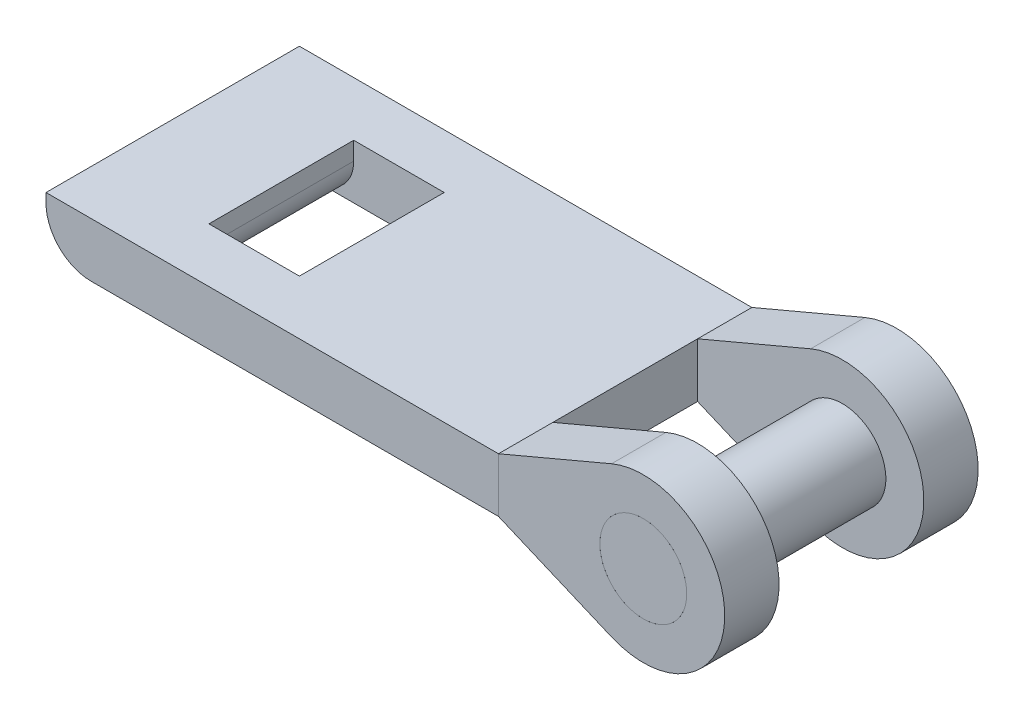
ISO-10303-21;
HEADER;
FILE_DESCRIPTION(('STEP AP214'),'2;1');
FILE_NAME('part.step','',(''),(''),'','','');
FILE_SCHEMA(('AUTOMOTIVE_DESIGN { 1 0 10303 214 1 1 1 1 }'));
ENDSEC;
DATA;
#1=APPLICATION_CONTEXT('core data for automotive mechanical design processes');
#2=APPLICATION_PROTOCOL_DEFINITION('international standard','automotive_design',2000,#1);
#3=PRODUCT_CONTEXT('',#1,'mechanical');
#4=PRODUCT('Part','Part','',(#3));
#5=PRODUCT_RELATED_PRODUCT_CATEGORY('part','',(#4));
#6=PRODUCT_DEFINITION_FORMATION('','',#4);
#7=PRODUCT_DEFINITION_CONTEXT('part definition',#1,'design');
#8=PRODUCT_DEFINITION('design','',#6,#7);
#9=PRODUCT_DEFINITION_SHAPE('','',#8);
#10=(LENGTH_UNIT() NAMED_UNIT(*) SI_UNIT(.MILLI.,.METRE.));
#11=(NAMED_UNIT(*) PLANE_ANGLE_UNIT() SI_UNIT($,.RADIAN.));
#12=(NAMED_UNIT(*) SI_UNIT($,.STERADIAN.) SOLID_ANGLE_UNIT());
#13=UNCERTAINTY_MEASURE_WITH_UNIT(LENGTH_MEASURE(1.E-05),#10,'distance_accuracy_value','');
#14=(GEOMETRIC_REPRESENTATION_CONTEXT(3) GLOBAL_UNCERTAINTY_ASSIGNED_CONTEXT((#13)) GLOBAL_UNIT_ASSIGNED_CONTEXT((#10,
#11,#12)) REPRESENTATION_CONTEXT('',''));
#15=CARTESIAN_POINT('',(0.,0.,0.));
#16=DIRECTION('',(0.,0.,1.));
#17=DIRECTION('',(1.,0.,0.));
#18=AXIS2_PLACEMENT_3D('',#15,#16,#17);
#19=CARTESIAN_POINT('',(-17.0003573718148,36.6972014984433,7.));
#20=DIRECTION('',(0.,-1.,0.));
#21=DIRECTION('',(0.,0.,-1.));
#22=AXIS2_PLACEMENT_3D('',#19,#20,#21);
#23=PLANE('',#22);
#24=DIRECTION('',(1.,0.,0.));
#25=VECTOR('',#24,1.);
#26=CARTESIAN_POINT('',(-9.00035737181482,36.6972014984433,4.));
#27=LINE('',#26,#25);
#28=CARTESIAN_POINT('',(-14.0003573718148,36.6972014984433,4.));
#29=VERTEX_POINT('',#28);
#30=CARTESIAN_POINT('',(-9.00035737181482,36.6972014984433,4.));
#31=VERTEX_POINT('',#30);
#32=EDGE_CURVE('E150',#29,#31,#27,.T.);
#33=ORIENTED_EDGE('',*,*,#32,.F.);
#34=DIRECTION('',(0.,0.,1.));
#35=VECTOR('',#34,1.);
#36=CARTESIAN_POINT('',(-14.0003573718148,36.6972014984433,4.));
#37=LINE('',#36,#35);
#38=CARTESIAN_POINT('',(-14.0003573718148,36.6972014984433,-4.));
#39=VERTEX_POINT('',#38);
#40=EDGE_CURVE('E145',#39,#29,#37,.T.);
#41=ORIENTED_EDGE('',*,*,#40,.F.);
#42=DIRECTION('',(-1.,0.,0.));
#43=VECTOR('',#42,1.);
#44=CARTESIAN_POINT('',(-9.00035737181482,36.6972014984433,-4.));
#45=LINE('',#44,#43);
#46=CARTESIAN_POINT('',(-9.00035737181482,36.6972014984433,-4.));
#47=VERTEX_POINT('',#46);
#48=EDGE_CURVE('E156',#47,#39,#45,.T.);
#49=ORIENTED_EDGE('',*,*,#48,.F.);
#50=DIRECTION('',(0.,0.,-1.));
#51=VECTOR('',#50,1.);
#52=CARTESIAN_POINT('',(-9.00035737181482,36.6972014984433,4.));
#53=LINE('',#52,#51);
#54=EDGE_CURVE('E153',#31,#47,#53,.T.);
#55=ORIENTED_EDGE('',*,*,#54,.F.);
#56=EDGE_LOOP('',(#33,#41,#49,#55));
#57=FACE_BOUND('',#56,.T.);
#58=DIRECTION('',(0.,0.,-1.));
#59=VECTOR('',#58,1.);
#60=CARTESIAN_POINT('',(4.99964262818518,36.6972014984433,7.));
#61=LINE('',#60,#59);
#62=CARTESIAN_POINT('',(4.99964262818518,36.6972014984433,7.));
#63=VERTEX_POINT('',#62);
#64=CARTESIAN_POINT('',(4.99964262818518,36.6972014984433,-7.));
#65=VERTEX_POINT('',#64);
#66=EDGE_CURVE('E162',#63,#65,#61,.T.);
#67=ORIENTED_EDGE('',*,*,#66,.T.);
#68=DIRECTION('',(1.,0.,0.));
#69=VECTOR('',#68,1.);
#70=CARTESIAN_POINT('',(-17.0003573718148,36.6972014984433,-7.));
#71=LINE('',#70,#69);
#72=CARTESIAN_POINT('',(-20.0003573718148,36.6972014984433,-7.));
#73=VERTEX_POINT('',#72);
#74=EDGE_CURVE('E142',#73,#65,#71,.T.);
#75=ORIENTED_EDGE('',*,*,#74,.F.);
#76=DIRECTION('',(0.,0.,-1.));
#77=VECTOR('',#76,1.);
#78=CARTESIAN_POINT('',(-20.0003573718148,36.6972014984433,7.));
#79=LINE('',#78,#77);
#80=CARTESIAN_POINT('',(-20.0003573718148,36.6972014984433,7.));
#81=VERTEX_POINT('',#80);
#82=EDGE_CURVE('E126',#81,#73,#79,.T.);
#83=ORIENTED_EDGE('',*,*,#82,.F.);
#84=DIRECTION('',(1.,0.,0.));
#85=VECTOR('',#84,1.);
#86=CARTESIAN_POINT('',(-17.0003573718148,36.6972014984433,7.));
#87=LINE('',#86,#85);
#88=EDGE_CURVE('E132',#81,#63,#87,.T.);
#89=ORIENTED_EDGE('',*,*,#88,.T.);
#90=EDGE_LOOP('',(#67,#75,#83,#89));
#91=FACE_BOUND('',#90,.T.);
#92=ADVANCED_FACE('F46',(#57,#91),#23,.F.);
#93=CARTESIAN_POINT('',(-17.0003573718148,36.6972014984433,-7.));
#94=DIRECTION('',(0.,0.,1.));
#95=DIRECTION('',(1.,0.,0.));
#96=AXIS2_PLACEMENT_3D('',#93,#94,#95);
#97=PLANE('',#96);
#98=DIRECTION('',(1.,0.,0.));
#99=VECTOR('',#98,1.);
#100=CARTESIAN_POINT('',(-17.0003573718148,33.6972014984433,-7.));
#101=LINE('',#100,#99);
#102=CARTESIAN_POINT('',(-17.5003573718148,33.6972014984433,-7.));
#103=VERTEX_POINT('',#102);
#104=CARTESIAN_POINT('',(4.99964262818518,33.6972014984433,-7.));
#105=VERTEX_POINT('',#104);
#106=EDGE_CURVE('E177',#103,#105,#101,.T.);
#107=ORIENTED_EDGE('',*,*,#106,.F.);
#108=CARTESIAN_POINT('',(-17.5003573718148,36.1972014984433,-7.));
#109=DIRECTION('',(0.,0.,1.));
#110=DIRECTION('',(1.,0.,0.));
#111=AXIS2_PLACEMENT_3D('',#108,#109,#110);
#112=CIRCLE('',#111,2.5);
#113=CARTESIAN_POINT('',(-20.0003573718148,36.1972014984433,-7.));
#114=VERTEX_POINT('',#113);
#115=EDGE_CURVE('E12',#103,#114,#112,.F.);
#116=ORIENTED_EDGE('',*,*,#115,.T.);
#117=DIRECTION('',(0.,-1.,0.));
#118=VECTOR('',#117,1.);
#119=CARTESIAN_POINT('',(-20.0003573718148,36.6972014984433,-7.));
#120=LINE('',#119,#118);
#121=EDGE_CURVE('E143',#73,#114,#120,.T.);
#122=ORIENTED_EDGE('',*,*,#121,.F.);
#123=ORIENTED_EDGE('',*,*,#74,.T.);
#124=DIRECTION('',(0.,-1.,0.));
#125=VECTOR('',#124,1.);
#126=CARTESIAN_POINT('',(4.99964262818518,36.6972014984433,-7.));
#127=LINE('',#126,#125);
#128=EDGE_CURVE('E169',#65,#105,#127,.T.);
#129=ORIENTED_EDGE('',*,*,#128,.T.);
#130=EDGE_LOOP('',(#107,#116,#122,#123,#129));
#131=FACE_BOUND('',#130,.T.);
#132=ADVANCED_FACE('F233',(#131),#97,.F.);
#133=CARTESIAN_POINT('',(-17.0003573718148,33.6972014984433,-7.));
#134=DIRECTION('',(0.,1.,0.));
#135=DIRECTION('',(0.,0.,1.));
#136=AXIS2_PLACEMENT_3D('',#133,#134,#135);
#137=PLANE('',#136);
#138=DIRECTION('',(0.,0.,1.));
#139=VECTOR('',#138,1.);
#140=CARTESIAN_POINT('',(-16.0003573718148,33.6972014984433,-7.));
#141=LINE('',#140,#139);
#142=CARTESIAN_POINT('',(-16.0003573718148,33.6972014984433,-4.));
#143=VERTEX_POINT('',#142);
#144=CARTESIAN_POINT('',(-16.0003573718148,33.6972014984433,4.));
#145=VERTEX_POINT('',#144);
#146=EDGE_CURVE('E188',#143,#145,#141,.T.);
#147=ORIENTED_EDGE('',*,*,#146,.T.);
#148=DIRECTION('',(1.,0.,0.));
#149=VECTOR('',#148,1.);
#150=CARTESIAN_POINT('',(-17.0003573718148,33.6972014984433,4.));
#151=LINE('',#150,#149);
#152=CARTESIAN_POINT('',(-9.00035737181482,33.6972014984433,4.));
#153=VERTEX_POINT('',#152);
#154=EDGE_CURVE('E180',#145,#153,#151,.T.);
#155=ORIENTED_EDGE('',*,*,#154,.T.);
#156=DIRECTION('',(0.,0.,-1.));
#157=VECTOR('',#156,1.);
#158=CARTESIAN_POINT('',(-9.00035737181482,33.6972014984433,-7.));
#159=LINE('',#158,#157);
#160=CARTESIAN_POINT('',(-9.00035737181482,33.6972014984433,-4.));
#161=VERTEX_POINT('',#160);
#162=EDGE_CURVE('E183',#153,#161,#159,.T.);
#163=ORIENTED_EDGE('',*,*,#162,.T.);
#164=DIRECTION('',(-1.,0.,0.));
#165=VECTOR('',#164,1.);
#166=CARTESIAN_POINT('',(-17.0003573718148,33.6972014984433,-4.));
#167=LINE('',#166,#165);
#168=EDGE_CURVE('E186',#161,#143,#167,.T.);
#169=ORIENTED_EDGE('',*,*,#168,.T.);
#170=EDGE_LOOP('',(#147,#155,#163,#169));
#171=FACE_BOUND('',#170,.T.);
#172=DIRECTION('',(1.,0.,0.));
#173=VECTOR('',#172,1.);
#174=CARTESIAN_POINT('',(-17.0003573718148,33.6972014984433,7.));
#175=LINE('',#174,#173);
#176=CARTESIAN_POINT('',(-17.5003573718148,33.6972014984433,7.));
#177=VERTEX_POINT('',#176);
#178=CARTESIAN_POINT('',(4.99964262818518,33.6972014984433,7.));
#179=VERTEX_POINT('',#178);
#180=EDGE_CURVE('E139',#177,#179,#175,.T.);
#181=ORIENTED_EDGE('',*,*,#180,.F.);
#182=DIRECTION('',(0.,0.,1.));
#183=VECTOR('',#182,1.);
#184=CARTESIAN_POINT('',(-17.5003573718148,33.6972014984433,-7.));
#185=LINE('',#184,#183);
#186=EDGE_CURVE('E54',#177,#103,#185,.F.);
#187=ORIENTED_EDGE('',*,*,#186,.T.);
#188=ORIENTED_EDGE('',*,*,#106,.T.);
#189=DIRECTION('',(0.,0.,1.));
#190=VECTOR('',#189,1.);
#191=CARTESIAN_POINT('',(4.99964262818518,33.6972014984433,-7.));
#192=LINE('',#191,#190);
#193=EDGE_CURVE('E172',#105,#179,#192,.T.);
#194=ORIENTED_EDGE('',*,*,#193,.T.);
#195=EDGE_LOOP('',(#181,#187,#188,#194));
#196=FACE_BOUND('',#195,.T.);
#197=ADVANCED_FACE('F210',(#171,#196),#137,.F.);
#198=CARTESIAN_POINT('',(-17.0003573718148,33.6972014984433,7.));
#199=DIRECTION('',(0.,0.,-1.));
#200=DIRECTION('',(-1.,0.,0.));
#201=AXIS2_PLACEMENT_3D('',#198,#199,#200);
#202=PLANE('',#201);
#203=DIRECTION('',(0.,1.,0.));
#204=VECTOR('',#203,1.);
#205=CARTESIAN_POINT('',(-20.0003573718148,33.6972014984433,7.));
#206=LINE('',#205,#204);
#207=CARTESIAN_POINT('',(-20.0003573718148,36.1972014984433,7.));
#208=VERTEX_POINT('',#207);
#209=EDGE_CURVE('E121',#208,#81,#206,.T.);
#210=ORIENTED_EDGE('',*,*,#209,.F.);
#211=CARTESIAN_POINT('',(-17.5003573718148,36.1972014984433,7.));
#212=DIRECTION('',(0.,0.,-1.));
#213=DIRECTION('',(-1.,0.,0.));
#214=AXIS2_PLACEMENT_3D('',#211,#212,#213);
#215=CIRCLE('',#214,2.5);
#216=EDGE_CURVE('E68',#208,#177,#215,.F.);
#217=ORIENTED_EDGE('',*,*,#216,.T.);
#218=ORIENTED_EDGE('',*,*,#180,.T.);
#219=DIRECTION('',(0.,1.,0.));
#220=VECTOR('',#219,1.);
#221=CARTESIAN_POINT('',(4.99964262818518,33.6972014984433,7.));
#222=LINE('',#221,#220);
#223=EDGE_CURVE('E135',#179,#63,#222,.T.);
#224=ORIENTED_EDGE('',*,*,#223,.T.);
#225=ORIENTED_EDGE('',*,*,#88,.F.);
#226=EDGE_LOOP('',(#210,#217,#218,#224,#225));
#227=FACE_BOUND('',#226,.T.);
#228=ADVANCED_FACE('F133',(#227),#202,.F.);
#229=CARTESIAN_POINT('',(4.99964262818518,0.,0.));
#230=DIRECTION('',(-1.,0.,0.));
#231=DIRECTION('',(0.,0.,1.));
#232=AXIS2_PLACEMENT_3D('',#229,#230,#231);
#233=PLANE('',#232);
#234=ORIENTED_EDGE('',*,*,#66,.F.);
#235=ORIENTED_EDGE('',*,*,#223,.F.);
#236=ORIENTED_EDGE('',*,*,#193,.F.);
#237=ORIENTED_EDGE('',*,*,#128,.F.);
#238=EDGE_LOOP('',(#234,#235,#236,#237));
#239=FACE_BOUND('',#238,.T.);
#240=ADVANCED_FACE('F245',(#239),#233,.F.);
#241=CARTESIAN_POINT('',(-14.0003573718148,30.6972014984433,4.));
#242=DIRECTION('',(-1.,0.,0.));
#243=DIRECTION('',(0.,0.,1.));
#244=AXIS2_PLACEMENT_3D('',#241,#242,#243);
#245=PLANE('',#244);
#246=DIRECTION('',(0.,1.,0.));
#247=VECTOR('',#246,1.);
#248=CARTESIAN_POINT('',(-14.0003573718148,30.6972014984433,4.));
#249=LINE('',#248,#247);
#250=CARTESIAN_POINT('',(-14.0003573718148,35.6972014984433,4.));
#251=VERTEX_POINT('',#250);
#252=EDGE_CURVE('E159',#251,#29,#249,.T.);
#253=ORIENTED_EDGE('',*,*,#252,.F.);
#254=DIRECTION('',(0.,0.,1.));
#255=VECTOR('',#254,1.);
#256=CARTESIAN_POINT('',(-14.0003573718148,35.6972014984433,4.));
#257=LINE('',#256,#255);
#258=CARTESIAN_POINT('',(-14.0003573718148,35.6972014984433,-4.));
#259=VERTEX_POINT('',#258);
#260=EDGE_CURVE('E191',#251,#259,#257,.F.);
#261=ORIENTED_EDGE('',*,*,#260,.T.);
#262=DIRECTION('',(0.,1.,0.));
#263=VECTOR('',#262,1.);
#264=CARTESIAN_POINT('',(-14.0003573718148,30.6972014984433,-4.));
#265=LINE('',#264,#263);
#266=EDGE_CURVE('E160',#259,#39,#265,.T.);
#267=ORIENTED_EDGE('',*,*,#266,.T.);
#268=ORIENTED_EDGE('',*,*,#40,.T.);
#269=EDGE_LOOP('',(#253,#261,#267,#268));
#270=FACE_BOUND('',#269,.T.);
#271=ADVANCED_FACE('F221',(#270),#245,.F.);
#272=CARTESIAN_POINT('',(-9.00035737181482,30.6972014984433,-4.));
#273=DIRECTION('',(0.,0.,-1.));
#274=DIRECTION('',(-1.,0.,0.));
#275=AXIS2_PLACEMENT_3D('',#272,#273,#274);
#276=PLANE('',#275);
#277=DIRECTION('',(0.,1.,0.));
#278=VECTOR('',#277,1.);
#279=CARTESIAN_POINT('',(-9.00035737181482,30.6972014984433,-4.));
#280=LINE('',#279,#278);
#281=EDGE_CURVE('E163',#161,#47,#280,.T.);
#282=ORIENTED_EDGE('',*,*,#281,.T.);
#283=ORIENTED_EDGE('',*,*,#48,.T.);
#284=ORIENTED_EDGE('',*,*,#266,.F.);
#285=CARTESIAN_POINT('',(-16.0003573718148,35.6972014984433,-4.));
#286=DIRECTION('',(0.,0.,-1.));
#287=DIRECTION('',(-1.,0.,0.));
#288=AXIS2_PLACEMENT_3D('',#285,#286,#287);
#289=CIRCLE('',#288,2.);
#290=EDGE_CURVE('E195',#259,#143,#289,.T.);
#291=ORIENTED_EDGE('',*,*,#290,.T.);
#292=ORIENTED_EDGE('',*,*,#168,.F.);
#293=EDGE_LOOP('',(#282,#283,#284,#291,#292));
#294=FACE_BOUND('',#293,.T.);
#295=ADVANCED_FACE('F203',(#294),#276,.F.);
#296=CARTESIAN_POINT('',(-9.00035737181482,30.6972014984433,4.));
#297=DIRECTION('',(1.,0.,0.));
#298=DIRECTION('',(0.,0.,-1.));
#299=AXIS2_PLACEMENT_3D('',#296,#297,#298);
#300=PLANE('',#299);
#301=DIRECTION('',(0.,1.,0.));
#302=VECTOR('',#301,1.);
#303=CARTESIAN_POINT('',(-9.00035737181482,30.6972014984433,4.));
#304=LINE('',#303,#302);
#305=EDGE_CURVE('E165',#153,#31,#304,.T.);
#306=ORIENTED_EDGE('',*,*,#305,.T.);
#307=ORIENTED_EDGE('',*,*,#54,.T.);
#308=ORIENTED_EDGE('',*,*,#281,.F.);
#309=ORIENTED_EDGE('',*,*,#162,.F.);
#310=EDGE_LOOP('',(#306,#307,#308,#309));
#311=FACE_BOUND('',#310,.T.);
#312=ADVANCED_FACE('F213',(#311),#300,.F.);
#313=CARTESIAN_POINT('',(-9.00035737181482,30.6972014984433,4.));
#314=DIRECTION('',(0.,0.,1.));
#315=DIRECTION('',(1.,0.,0.));
#316=AXIS2_PLACEMENT_3D('',#313,#314,#315);
#317=PLANE('',#316);
#318=ORIENTED_EDGE('',*,*,#154,.F.);
#319=CARTESIAN_POINT('',(-16.0003573718148,35.6972014984433,4.));
#320=DIRECTION('',(0.,0.,1.));
#321=DIRECTION('',(1.,0.,0.));
#322=AXIS2_PLACEMENT_3D('',#319,#320,#321);
#323=CIRCLE('',#322,2.);
#324=EDGE_CURVE('E193',#145,#251,#323,.T.);
#325=ORIENTED_EDGE('',*,*,#324,.T.);
#326=ORIENTED_EDGE('',*,*,#252,.T.);
#327=ORIENTED_EDGE('',*,*,#32,.T.);
#328=ORIENTED_EDGE('',*,*,#305,.F.);
#329=EDGE_LOOP('',(#318,#325,#326,#327,#328));
#330=FACE_BOUND('',#329,.T.);
#331=ADVANCED_FACE('F223',(#330),#317,.F.);
#332=CARTESIAN_POINT('',(-16.0003573718148,35.6972014984433,-7.));
#333=DIRECTION('',(0.,0.,1.));
#334=DIRECTION('',(1.,0.,0.));
#335=AXIS2_PLACEMENT_3D('',#332,#333,#334);
#336=CYLINDRICAL_SURFACE('',#335,2.);
#337=ORIENTED_EDGE('',*,*,#290,.F.);
#338=ORIENTED_EDGE('',*,*,#260,.F.);
#339=ORIENTED_EDGE('',*,*,#324,.F.);
#340=ORIENTED_EDGE('',*,*,#146,.F.);
#341=EDGE_LOOP('',(#337,#338,#339,#340));
#342=FACE_BOUND('',#341,.T.);
#343=ADVANCED_FACE('F208',(#342),#336,.T.);
#344=CARTESIAN_POINT('',(-20.0003573718148,0.,0.));
#345=DIRECTION('',(-1.,0.,0.));
#346=DIRECTION('',(0.,0.,1.));
#347=AXIS2_PLACEMENT_3D('',#344,#345,#346);
#348=PLANE('',#347);
#349=ORIENTED_EDGE('',*,*,#121,.T.);
#350=DIRECTION('',(0.,0.,1.));
#351=VECTOR('',#350,1.);
#352=CARTESIAN_POINT('',(-20.0003573718148,36.1972014984433,7.));
#353=LINE('',#352,#351);
#354=EDGE_CURVE('E129',#114,#208,#353,.T.);
#355=ORIENTED_EDGE('',*,*,#354,.T.);
#356=ORIENTED_EDGE('',*,*,#209,.T.);
#357=ORIENTED_EDGE('',*,*,#82,.T.);
#358=EDGE_LOOP('',(#349,#355,#356,#357));
#359=FACE_BOUND('',#358,.T.);
#360=ADVANCED_FACE('F124',(#359),#348,.T.);
#361=CARTESIAN_POINT('',(-17.5003573718148,36.1972014984433,0.));
#362=DIRECTION('',(0.,0.,-1.));
#363=DIRECTION('',(-1.,0.,0.));
#364=AXIS2_PLACEMENT_3D('',#361,#362,#363);
#365=CYLINDRICAL_SURFACE('',#364,2.5);
#366=ORIENTED_EDGE('',*,*,#115,.F.);
#367=ORIENTED_EDGE('',*,*,#186,.F.);
#368=ORIENTED_EDGE('',*,*,#216,.F.);
#369=ORIENTED_EDGE('',*,*,#354,.F.);
#370=EDGE_LOOP('',(#366,#367,#368,#369));
#371=FACE_BOUND('',#370,.T.);
#372=ADVANCED_FACE('F48',(#371),#365,.T.);
#373=CLOSED_SHELL('',(#92,#132,#197,#228,#240,#271,#295,#312,#331,#343,#360,#372));
#374=MANIFOLD_SOLID_BREP('B2',#373);
#375=CARTESIAN_POINT('',(12.9996426281852,35.1972014984433,4.));
#376=DIRECTION('',(0.,0.,1.));
#377=DIRECTION('',(-1.,0.,0.));
#378=AXIS2_PLACEMENT_3D('',#375,#376,#377);
#379=CYLINDRICAL_SURFACE('',#378,4.5);
#380=CARTESIAN_POINT('',(12.9996426281852,35.1972014984433,7.));
#381=DIRECTION('',(0.,0.,-1.));
#382=DIRECTION('',(-1.,0.,0.));
#383=AXIS2_PLACEMENT_3D('',#380,#381,#382);
#384=CIRCLE('',#383,4.5);
#385=CARTESIAN_POINT('',(11.2453894566545,39.3411845836133,7.));
#386=VERTEX_POINT('',#385);
#387=CARTESIAN_POINT('',(11.2453894566545,31.0532184132734,7.));
#388=VERTEX_POINT('',#387);
#389=EDGE_CURVE('E414',#386,#388,#384,.T.);
#390=ORIENTED_EDGE('',*,*,#389,.T.);
#391=DIRECTION('',(0.,0.,1.));
#392=VECTOR('',#391,1.);
#393=CARTESIAN_POINT('',(11.2453894566545,31.0532184132734,4.));
#394=LINE('',#393,#392);
#395=CARTESIAN_POINT('',(11.2453894566545,31.0532184132734,4.));
#396=VERTEX_POINT('',#395);
#397=EDGE_CURVE('E353',#396,#388,#394,.T.);
#398=ORIENTED_EDGE('',*,*,#397,.F.);
#399=CARTESIAN_POINT('',(12.9996426281852,35.1972014984433,4.));
#400=DIRECTION('',(0.,0.,-1.));
#401=DIRECTION('',(-1.,0.,0.));
#402=AXIS2_PLACEMENT_3D('',#399,#400,#401);
#403=CIRCLE('',#402,4.5);
#404=CARTESIAN_POINT('',(11.2453894566545,39.3411845836133,4.));
#405=VERTEX_POINT('',#404);
#406=EDGE_CURVE('E403',#405,#396,#403,.T.);
#407=ORIENTED_EDGE('',*,*,#406,.F.);
#408=DIRECTION('',(0.,0.,1.));
#409=VECTOR('',#408,1.);
#410=CARTESIAN_POINT('',(11.2453894566545,39.3411845836133,4.));
#411=LINE('',#410,#409);
#412=EDGE_CURVE('E44',#405,#386,#411,.T.);
#413=ORIENTED_EDGE('',*,*,#412,.T.);
#414=EDGE_LOOP('',(#390,#398,#407,#413));
#415=FACE_BOUND('',#414,.T.);
#416=ADVANCED_FACE('F350',(#415),#379,.T.);
#417=CARTESIAN_POINT('',(11.2453894566545,39.3411845836133,4.));
#418=DIRECTION('',(-0.389834038117918,0.920885130037768,0.));
#419=DIRECTION('',(-0.920885130037768,-0.389834038117919,0.));
#420=AXIS2_PLACEMENT_3D('',#417,#418,#419);
#421=PLANE('',#420);
#422=DIRECTION('',(0.920885130037768,0.389834038117918,0.));
#423=VECTOR('',#422,1.);
#424=CARTESIAN_POINT('',(11.2453894566545,39.3411845836133,7.));
#425=LINE('',#424,#423);
#426=CARTESIAN_POINT('',(4.99964262818518,36.6972014984433,7.));
#427=VERTEX_POINT('',#426);
#428=EDGE_CURVE('E391',#427,#386,#425,.T.);
#429=ORIENTED_EDGE('',*,*,#428,.T.);
#430=ORIENTED_EDGE('',*,*,#412,.F.);
#431=DIRECTION('',(0.920885130037768,0.389834038117918,0.));
#432=VECTOR('',#431,1.);
#433=CARTESIAN_POINT('',(11.2453894566545,39.3411845836133,4.));
#434=LINE('',#433,#432);
#435=CARTESIAN_POINT('',(4.99964262818518,36.6972014984433,4.));
#436=VERTEX_POINT('',#435);
#437=EDGE_CURVE('E368',#436,#405,#434,.T.);
#438=ORIENTED_EDGE('',*,*,#437,.F.);
#439=DIRECTION('',(0.,0.,1.));
#440=VECTOR('',#439,1.);
#441=CARTESIAN_POINT('',(4.99964262818518,36.6972014984433,4.));
#442=LINE('',#441,#440);
#443=EDGE_CURVE('E359',#436,#427,#442,.T.);
#444=ORIENTED_EDGE('',*,*,#443,.T.);
#445=EDGE_LOOP('',(#429,#430,#438,#444));
#446=FACE_BOUND('',#445,.T.);
#447=ADVANCED_FACE('F421',(#446),#421,.T.);
#448=CARTESIAN_POINT('',(4.99964262818518,33.6972014984433,4.));
#449=DIRECTION('',(-1.,0.,0.));
#450=DIRECTION('',(0.,0.,-1.));
#451=AXIS2_PLACEMENT_3D('',#448,#449,#450);
#452=PLANE('',#451);
#453=DIRECTION('',(0.,1.,0.));
#454=VECTOR('',#453,1.);
#455=CARTESIAN_POINT('',(4.99964262818518,33.6972014984433,7.));
#456=LINE('',#455,#454);
#457=CARTESIAN_POINT('',(4.99964262818518,33.6972014984433,7.));
#458=VERTEX_POINT('',#457);
#459=EDGE_CURVE('E385',#458,#427,#456,.T.);
#460=ORIENTED_EDGE('',*,*,#459,.T.);
#461=ORIENTED_EDGE('',*,*,#443,.F.);
#462=DIRECTION('',(0.,1.,0.));
#463=VECTOR('',#462,1.);
#464=CARTESIAN_POINT('',(4.99964262818518,33.6972014984433,4.));
#465=LINE('',#464,#463);
#466=CARTESIAN_POINT('',(4.99964262818518,33.6972014984433,4.));
#467=VERTEX_POINT('',#466);
#468=EDGE_CURVE('E401',#467,#436,#465,.T.);
#469=ORIENTED_EDGE('',*,*,#468,.F.);
#470=DIRECTION('',(0.,0.,1.));
#471=VECTOR('',#470,1.);
#472=CARTESIAN_POINT('',(4.99964262818518,33.6972014984433,4.));
#473=LINE('',#472,#471);
#474=EDGE_CURVE('E406',#467,#458,#473,.T.);
#475=ORIENTED_EDGE('',*,*,#474,.T.);
#476=EDGE_LOOP('',(#460,#461,#469,#475));
#477=FACE_BOUND('',#476,.T.);
#478=ADVANCED_FACE('F409',(#477),#452,.T.);
#479=CARTESIAN_POINT('',(11.2453894566545,31.0532184132734,4.));
#480=DIRECTION('',(-0.389834038117918,-0.920885130037768,0.));
#481=DIRECTION('',(0.920885130037768,-0.389834038117919,0.));
#482=AXIS2_PLACEMENT_3D('',#479,#480,#481);
#483=PLANE('',#482);
#484=DIRECTION('',(-0.920885130037768,0.389834038117918,0.));
#485=VECTOR('',#484,1.);
#486=CARTESIAN_POINT('',(11.2453894566545,31.0532184132734,7.));
#487=LINE('',#486,#485);
#488=EDGE_CURVE('E408',#388,#458,#487,.T.);
#489=ORIENTED_EDGE('',*,*,#488,.T.);
#490=ORIENTED_EDGE('',*,*,#474,.F.);
#491=DIRECTION('',(-0.920885130037768,0.389834038117918,0.));
#492=VECTOR('',#491,1.);
#493=CARTESIAN_POINT('',(11.2453894566545,31.0532184132734,4.));
#494=LINE('',#493,#492);
#495=EDGE_CURVE('E398',#396,#467,#494,.T.);
#496=ORIENTED_EDGE('',*,*,#495,.F.);
#497=ORIENTED_EDGE('',*,*,#397,.T.);
#498=EDGE_LOOP('',(#489,#490,#496,#497));
#499=FACE_BOUND('',#498,.T.);
#500=ADVANCED_FACE('F407',(#499),#483,.T.);
#501=CARTESIAN_POINT('',(12.9996426281852,35.1972014984433,4.));
#502=DIRECTION('',(0.,0.,1.));
#503=DIRECTION('',(-1.,0.,0.));
#504=AXIS2_PLACEMENT_3D('',#501,#502,#503);
#505=PLANE('',#504);
#506=CARTESIAN_POINT('',(12.9996426281852,35.1972014984433,4.));
#507=DIRECTION('',(0.,0.,-1.));
#508=DIRECTION('',(-1.,0.,0.));
#509=AXIS2_PLACEMENT_3D('',#506,#507,#508);
#510=CIRCLE('',#509,2.40000000000001);
#511=CARTESIAN_POINT('',(10.5996426281852,35.1972014984433,4.));
#512=VERTEX_POINT('',#511);
#513=EDGE_CURVE('E417',#512,#512,#510,.T.);
#514=ORIENTED_EDGE('',*,*,#513,.F.);
#515=EDGE_LOOP('',(#514));
#516=FACE_BOUND('',#515,.T.);
#517=ORIENTED_EDGE('',*,*,#406,.T.);
#518=ORIENTED_EDGE('',*,*,#495,.T.);
#519=ORIENTED_EDGE('',*,*,#468,.T.);
#520=ORIENTED_EDGE('',*,*,#437,.T.);
#521=EDGE_LOOP('',(#517,#518,#519,#520));
#522=FACE_BOUND('',#521,.T.);
#523=ADVANCED_FACE('F399',(#516,#522),#505,.F.);
#524=CARTESIAN_POINT('',(12.9996426281852,35.1972014984433,7.));
#525=DIRECTION('',(0.,0.,1.));
#526=DIRECTION('',(-1.,0.,0.));
#527=AXIS2_PLACEMENT_3D('',#524,#525,#526);
#528=PLANE('',#527);
#529=CARTESIAN_POINT('',(12.9996426281852,35.1972014984433,7.));
#530=DIRECTION('',(0.,0.,-1.));
#531=DIRECTION('',(-1.,0.,0.));
#532=AXIS2_PLACEMENT_3D('',#529,#530,#531);
#533=CIRCLE('',#532,2.40000000000001);
#534=CARTESIAN_POINT('',(10.5996426281852,35.1972014984433,7.));
#535=VERTEX_POINT('',#534);
#536=EDGE_CURVE('E427',#535,#535,#533,.T.);
#537=ORIENTED_EDGE('',*,*,#536,.T.);
#538=EDGE_LOOP('',(#537));
#539=FACE_BOUND('',#538,.T.);
#540=ORIENTED_EDGE('',*,*,#389,.F.);
#541=ORIENTED_EDGE('',*,*,#428,.F.);
#542=ORIENTED_EDGE('',*,*,#459,.F.);
#543=ORIENTED_EDGE('',*,*,#488,.F.);
#544=EDGE_LOOP('',(#540,#541,#542,#543));
#545=FACE_BOUND('',#544,.T.);
#546=ADVANCED_FACE('F424',(#539,#545),#528,.T.);
#547=CARTESIAN_POINT('',(12.9996426281852,35.1972014984433,4.));
#548=DIRECTION('',(0.,0.,1.));
#549=DIRECTION('',(-1.,0.,0.));
#550=AXIS2_PLACEMENT_3D('',#547,#548,#549);
#551=CYLINDRICAL_SURFACE('',#550,2.40000000000001);
#552=ORIENTED_EDGE('',*,*,#513,.T.);
#553=EDGE_LOOP('',(#552));
#554=FACE_BOUND('',#553,.T.);
#555=ORIENTED_EDGE('',*,*,#536,.F.);
#556=EDGE_LOOP('',(#555));
#557=FACE_BOUND('',#556,.T.);
#558=ADVANCED_FACE('F433',(#554,#557),#551,.F.);
#559=CLOSED_SHELL('',(#416,#447,#478,#500,#523,#546,#558));
#560=MANIFOLD_SOLID_BREP('B6',#559);
#561=CARTESIAN_POINT('',(12.9996426281852,35.1972014984433,-4.));
#562=DIRECTION('',(0.,0.,-1.));
#563=DIRECTION('',(-1.,0.,0.));
#564=AXIS2_PLACEMENT_3D('',#561,#562,#563);
#565=CYLINDRICAL_SURFACE('',#564,4.5);
#566=CARTESIAN_POINT('',(12.9996426281852,35.1972014984433,-7.));
#567=DIRECTION('',(0.,0.,-1.));
#568=DIRECTION('',(-1.,0.,0.));
#569=AXIS2_PLACEMENT_3D('',#566,#567,#568);
#570=CIRCLE('',#569,4.5);
#571=CARTESIAN_POINT('',(11.2453894566545,39.3411845836133,-7.));
#572=VERTEX_POINT('',#571);
#573=CARTESIAN_POINT('',(11.2453894566545,31.0532184132734,-7.));
#574=VERTEX_POINT('',#573);
#575=EDGE_CURVE('E567',#572,#574,#570,.T.);
#576=ORIENTED_EDGE('',*,*,#575,.F.);
#577=DIRECTION('',(0.,0.,-1.));
#578=VECTOR('',#577,1.);
#579=CARTESIAN_POINT('',(11.2453894566545,39.3411845836133,-4.));
#580=LINE('',#579,#578);
#581=CARTESIAN_POINT('',(11.2453894566545,39.3411845836133,-4.));
#582=VERTEX_POINT('',#581);
#583=EDGE_CURVE('E348',#582,#572,#580,.T.);
#584=ORIENTED_EDGE('',*,*,#583,.F.);
#585=CARTESIAN_POINT('',(12.9996426281852,35.1972014984433,-4.));
#586=DIRECTION('',(0.,0.,-1.));
#587=DIRECTION('',(-1.,0.,0.));
#588=AXIS2_PLACEMENT_3D('',#585,#586,#587);
#589=CIRCLE('',#588,4.5);
#590=CARTESIAN_POINT('',(11.2453894566545,31.0532184132734,-4.));
#591=VERTEX_POINT('',#590);
#592=EDGE_CURVE('E560',#582,#591,#589,.T.);
#593=ORIENTED_EDGE('',*,*,#592,.T.);
#594=DIRECTION('',(0.,0.,-1.));
#595=VECTOR('',#594,1.);
#596=CARTESIAN_POINT('',(11.2453894566545,31.0532184132734,-4.));
#597=LINE('',#596,#595);
#598=EDGE_CURVE('E505',#591,#574,#597,.T.);
#599=ORIENTED_EDGE('',*,*,#598,.T.);
#600=EDGE_LOOP('',(#576,#584,#593,#599));
#601=FACE_BOUND('',#600,.T.);
#602=ADVANCED_FACE('F502',(#601),#565,.T.);
#603=CARTESIAN_POINT('',(11.2453894566545,39.3411845836133,-4.));
#604=DIRECTION('',(-0.389834038117918,0.920885130037768,0.));
#605=DIRECTION('',(-0.920885130037768,-0.389834038117919,0.));
#606=AXIS2_PLACEMENT_3D('',#603,#604,#605);
#607=PLANE('',#606);
#608=DIRECTION('',(0.920885130037768,0.389834038117918,0.));
#609=VECTOR('',#608,1.);
#610=CARTESIAN_POINT('',(11.2453894566545,39.3411845836133,-7.));
#611=LINE('',#610,#609);
#612=CARTESIAN_POINT('',(4.99964262818518,36.6972014984433,-7.));
#613=VERTEX_POINT('',#612);
#614=EDGE_CURVE('E562',#613,#572,#611,.T.);
#615=ORIENTED_EDGE('',*,*,#614,.F.);
#616=DIRECTION('',(0.,0.,-1.));
#617=VECTOR('',#616,1.);
#618=CARTESIAN_POINT('',(4.99964262818518,36.6972014984433,-4.));
#619=LINE('',#618,#617);
#620=CARTESIAN_POINT('',(4.99964262818518,36.6972014984433,-4.));
#621=VERTEX_POINT('',#620);
#622=EDGE_CURVE('E511',#621,#613,#619,.T.);
#623=ORIENTED_EDGE('',*,*,#622,.F.);
#624=DIRECTION('',(0.920885130037768,0.389834038117918,0.));
#625=VECTOR('',#624,1.);
#626=CARTESIAN_POINT('',(11.2453894566545,39.3411845836133,-4.));
#627=LINE('',#626,#625);
#628=EDGE_CURVE('E557',#621,#582,#627,.T.);
#629=ORIENTED_EDGE('',*,*,#628,.T.);
#630=ORIENTED_EDGE('',*,*,#583,.T.);
#631=EDGE_LOOP('',(#615,#623,#629,#630));
#632=FACE_BOUND('',#631,.T.);
#633=ADVANCED_FACE('F578',(#632),#607,.T.);
#634=CARTESIAN_POINT('',(4.99964262818518,33.6972014984433,-4.));
#635=DIRECTION('',(-1.,0.,0.));
#636=DIRECTION('',(0.,0.,1.));
#637=AXIS2_PLACEMENT_3D('',#634,#635,#636);
#638=PLANE('',#637);
#639=DIRECTION('',(0.,1.,0.));
#640=VECTOR('',#639,1.);
#641=CARTESIAN_POINT('',(4.99964262818518,33.6972014984433,-7.));
#642=LINE('',#641,#640);
#643=CARTESIAN_POINT('',(4.99964262818518,33.6972014984433,-7.));
#644=VERTEX_POINT('',#643);
#645=EDGE_CURVE('E552',#644,#613,#642,.T.);
#646=ORIENTED_EDGE('',*,*,#645,.F.);
#647=DIRECTION('',(0.,0.,-1.));
#648=VECTOR('',#647,1.);
#649=CARTESIAN_POINT('',(4.99964262818518,33.6972014984433,-4.));
#650=LINE('',#649,#648);
#651=CARTESIAN_POINT('',(4.99964262818518,33.6972014984433,-4.));
#652=VERTEX_POINT('',#651);
#653=EDGE_CURVE('E547',#652,#644,#650,.T.);
#654=ORIENTED_EDGE('',*,*,#653,.F.);
#655=DIRECTION('',(0.,1.,0.));
#656=VECTOR('',#655,1.);
#657=CARTESIAN_POINT('',(4.99964262818518,33.6972014984433,-4.));
#658=LINE('',#657,#656);
#659=EDGE_CURVE('E550',#652,#621,#658,.T.);
#660=ORIENTED_EDGE('',*,*,#659,.T.);
#661=ORIENTED_EDGE('',*,*,#622,.T.);
#662=EDGE_LOOP('',(#646,#654,#660,#661));
#663=FACE_BOUND('',#662,.T.);
#664=ADVANCED_FACE('F549',(#663),#638,.T.);
#665=CARTESIAN_POINT('',(11.2453894566545,31.0532184132734,-4.));
#666=DIRECTION('',(-0.389834038117918,-0.920885130037768,0.));
#667=DIRECTION('',(0.920885130037768,-0.389834038117919,0.));
#668=AXIS2_PLACEMENT_3D('',#665,#666,#667);
#669=PLANE('',#668);
#670=DIRECTION('',(-0.920885130037768,0.389834038117918,0.));
#671=VECTOR('',#670,1.);
#672=CARTESIAN_POINT('',(11.2453894566545,31.0532184132734,-7.));
#673=LINE('',#672,#671);
#674=EDGE_CURVE('E570',#574,#644,#673,.T.);
#675=ORIENTED_EDGE('',*,*,#674,.F.);
#676=ORIENTED_EDGE('',*,*,#598,.F.);
#677=DIRECTION('',(-0.920885130037768,0.389834038117918,0.));
#678=VECTOR('',#677,1.);
#679=CARTESIAN_POINT('',(11.2453894566545,31.0532184132734,-4.));
#680=LINE('',#679,#678);
#681=EDGE_CURVE('E556',#591,#652,#680,.T.);
#682=ORIENTED_EDGE('',*,*,#681,.T.);
#683=ORIENTED_EDGE('',*,*,#653,.T.);
#684=EDGE_LOOP('',(#675,#676,#682,#683));
#685=FACE_BOUND('',#684,.T.);
#686=ADVANCED_FACE('F559',(#685),#669,.T.);
#687=CARTESIAN_POINT('',(12.9996426281852,35.1972014984433,-4.));
#688=DIRECTION('',(0.,0.,-1.));
#689=DIRECTION('',(-1.,0.,0.));
#690=AXIS2_PLACEMENT_3D('',#687,#688,#689);
#691=PLANE('',#690);
#692=CARTESIAN_POINT('',(12.9996426281852,35.1972014984433,-4.));
#693=DIRECTION('',(0.,0.,-1.));
#694=DIRECTION('',(-1.,0.,0.));
#695=AXIS2_PLACEMENT_3D('',#692,#693,#694);
#696=CIRCLE('',#695,2.40000000000001);
#697=CARTESIAN_POINT('',(10.5996426281852,35.1972014984433,-4.));
#698=VERTEX_POINT('',#697);
#699=EDGE_CURVE('E571',#698,#698,#696,.T.);
#700=ORIENTED_EDGE('',*,*,#699,.T.);
#701=EDGE_LOOP('',(#700));
#702=FACE_BOUND('',#701,.T.);
#703=ORIENTED_EDGE('',*,*,#592,.F.);
#704=ORIENTED_EDGE('',*,*,#628,.F.);
#705=ORIENTED_EDGE('',*,*,#659,.F.);
#706=ORIENTED_EDGE('',*,*,#681,.F.);
#707=EDGE_LOOP('',(#703,#704,#705,#706));
#708=FACE_BOUND('',#707,.T.);
#709=ADVANCED_FACE('F555',(#702,#708),#691,.F.);
#710=CARTESIAN_POINT('',(12.9996426281852,35.1972014984433,-7.));
#711=DIRECTION('',(0.,0.,-1.));
#712=DIRECTION('',(-1.,0.,0.));
#713=AXIS2_PLACEMENT_3D('',#710,#711,#712);
#714=PLANE('',#713);
#715=CARTESIAN_POINT('',(12.9996426281852,35.1972014984433,-7.));
#716=DIRECTION('',(0.,0.,-1.));
#717=DIRECTION('',(-1.,0.,0.));
#718=AXIS2_PLACEMENT_3D('',#715,#716,#717);
#719=CIRCLE('',#718,2.40000000000001);
#720=CARTESIAN_POINT('',(10.5996426281852,35.1972014984433,-7.));
#721=VERTEX_POINT('',#720);
#722=EDGE_CURVE('E608',#721,#721,#719,.T.);
#723=ORIENTED_EDGE('',*,*,#722,.F.);
#724=EDGE_LOOP('',(#723));
#725=FACE_BOUND('',#724,.T.);
#726=ORIENTED_EDGE('',*,*,#575,.T.);
#727=ORIENTED_EDGE('',*,*,#674,.T.);
#728=ORIENTED_EDGE('',*,*,#645,.T.);
#729=ORIENTED_EDGE('',*,*,#614,.T.);
#730=EDGE_LOOP('',(#726,#727,#728,#729));
#731=FACE_BOUND('',#730,.T.);
#732=ADVANCED_FACE('F577',(#725,#731),#714,.T.);
#733=CARTESIAN_POINT('',(12.9996426281852,35.1972014984433,-4.));
#734=DIRECTION('',(0.,0.,-1.));
#735=DIRECTION('',(-1.,0.,0.));
#736=AXIS2_PLACEMENT_3D('',#733,#734,#735);
#737=CYLINDRICAL_SURFACE('',#736,2.40000000000001);
#738=ORIENTED_EDGE('',*,*,#699,.F.);
#739=EDGE_LOOP('',(#738));
#740=FACE_BOUND('',#739,.T.);
#741=ORIENTED_EDGE('',*,*,#722,.T.);
#742=EDGE_LOOP('',(#741));
#743=FACE_BOUND('',#742,.T.);
#744=ADVANCED_FACE('F596',(#740,#743),#737,.F.);
#745=CLOSED_SHELL('',(#602,#633,#664,#686,#709,#732,#744));
#746=MANIFOLD_SOLID_BREP('B38',#745);
#747=CARTESIAN_POINT('',(12.9996426281852,35.1972014984433,7.));
#748=DIRECTION('',(0.,0.,-1.));
#749=DIRECTION('',(-1.,0.,0.));
#750=AXIS2_PLACEMENT_3D('',#747,#748,#749);
#751=CYLINDRICAL_SURFACE('',#750,2.4);
#752=CARTESIAN_POINT('',(12.9996426281852,35.1972014984433,7.));
#753=DIRECTION('',(0.,0.,1.));
#754=DIRECTION('',(1.,0.,0.));
#755=AXIS2_PLACEMENT_3D('',#752,#753,#754);
#756=CIRCLE('',#755,2.4);
#757=CARTESIAN_POINT('',(15.3996426281852,35.1972014984433,7.));
#758=VERTEX_POINT('',#757);
#759=EDGE_CURVE('E501',#758,#758,#756,.T.);
#760=ORIENTED_EDGE('',*,*,#759,.F.);
#761=EDGE_LOOP('',(#760));
#762=FACE_BOUND('',#761,.T.);
#763=CARTESIAN_POINT('',(12.9996426281852,35.1972014984433,-7.));
#764=DIRECTION('',(0.,0.,1.));
#765=DIRECTION('',(1.,0.,0.));
#766=AXIS2_PLACEMENT_3D('',#763,#764,#765);
#767=CIRCLE('',#766,2.4);
#768=CARTESIAN_POINT('',(15.3996426281852,35.1972014984433,-7.));
#769=VERTEX_POINT('',#768);
#770=EDGE_CURVE('E650',#769,#769,#767,.T.);
#771=ORIENTED_EDGE('',*,*,#770,.T.);
#772=EDGE_LOOP('',(#771));
#773=FACE_BOUND('',#772,.T.);
#774=ADVANCED_FACE('F647',(#762,#773),#751,.T.);
#775=CARTESIAN_POINT('',(12.9996426281852,35.1972014984433,7.));
#776=DIRECTION('',(0.,0.,1.));
#777=DIRECTION('',(1.,0.,0.));
#778=AXIS2_PLACEMENT_3D('',#775,#776,#777);
#779=PLANE('',#778);
#780=ORIENTED_EDGE('',*,*,#759,.T.);
#781=EDGE_LOOP('',(#780));
#782=FACE_BOUND('',#781,.T.);
#783=ADVANCED_FACE('F662',(#782),#779,.T.);
#784=CARTESIAN_POINT('',(12.9996426281852,35.1972014984433,-7.));
#785=DIRECTION('',(0.,0.,1.));
#786=DIRECTION('',(1.,0.,0.));
#787=AXIS2_PLACEMENT_3D('',#784,#785,#786);
#788=PLANE('',#787);
#789=ORIENTED_EDGE('',*,*,#770,.F.);
#790=EDGE_LOOP('',(#789));
#791=FACE_BOUND('',#790,.T.);
#792=ADVANCED_FACE('F660',(#791),#788,.F.);
#793=CLOSED_SHELL('',(#774,#783,#792));
#794=MANIFOLD_SOLID_BREP('B342',#793);
#795=ADVANCED_BREP_SHAPE_REPRESENTATION('',(#18,#374,#560,#746,#794),#14);
#796=SHAPE_DEFINITION_REPRESENTATION(#9,#795);
ENDSEC;
END-ISO-10303-21;
